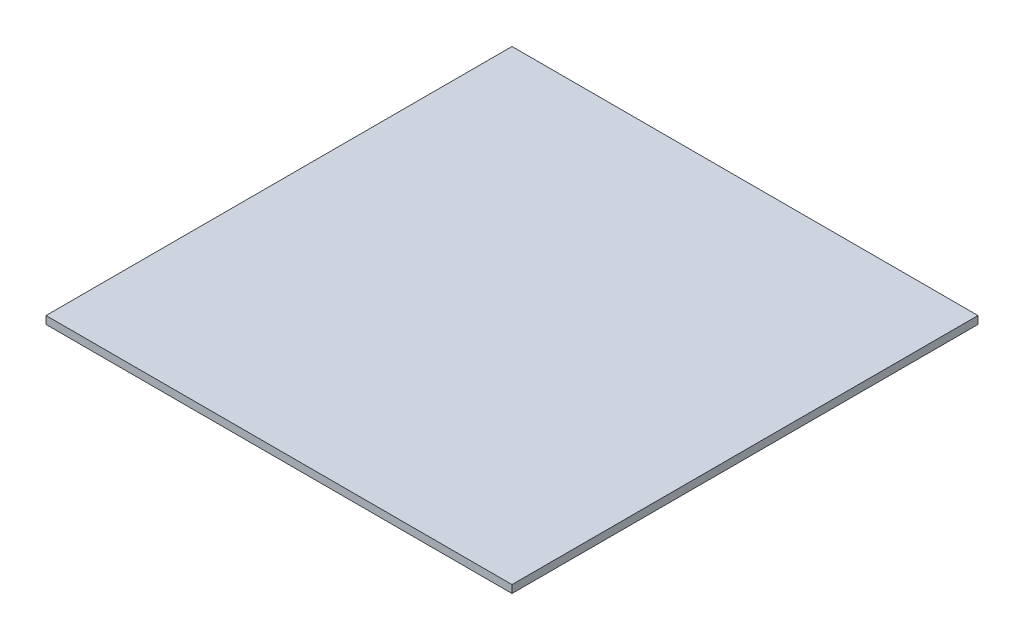
ISO-10303-21;
HEADER;
FILE_DESCRIPTION(('STEP AP214'),'2;1');
FILE_NAME('part.step','',(''),(''),'','','');
FILE_SCHEMA(('AUTOMOTIVE_DESIGN { 1 0 10303 214 1 1 1 1 }'));
ENDSEC;
DATA;
#1=APPLICATION_CONTEXT('core data for automotive mechanical design processes');
#2=APPLICATION_PROTOCOL_DEFINITION('international standard','automotive_design',2000,#1);
#3=PRODUCT_CONTEXT('',#1,'mechanical');
#4=PRODUCT('Part','Part','',(#3));
#5=PRODUCT_RELATED_PRODUCT_CATEGORY('part','',(#4));
#6=PRODUCT_DEFINITION_FORMATION('','',#4);
#7=PRODUCT_DEFINITION_CONTEXT('part definition',#1,'design');
#8=PRODUCT_DEFINITION('design','',#6,#7);
#9=PRODUCT_DEFINITION_SHAPE('','',#8);
#10=(LENGTH_UNIT() NAMED_UNIT(*) SI_UNIT(.MILLI.,.METRE.));
#11=(NAMED_UNIT(*) PLANE_ANGLE_UNIT() SI_UNIT($,.RADIAN.));
#12=(NAMED_UNIT(*) SI_UNIT($,.STERADIAN.) SOLID_ANGLE_UNIT());
#13=UNCERTAINTY_MEASURE_WITH_UNIT(LENGTH_MEASURE(1.E-05),#10,'distance_accuracy_value','');
#14=(GEOMETRIC_REPRESENTATION_CONTEXT(3) GLOBAL_UNCERTAINTY_ASSIGNED_CONTEXT((#13)) GLOBAL_UNIT_ASSIGNED_CONTEXT((#10,
#11,#12)) REPRESENTATION_CONTEXT('',''));
#15=CARTESIAN_POINT('',(0.,0.,0.));
#16=DIRECTION('',(0.,0.,1.));
#17=DIRECTION('',(1.,0.,0.));
#18=AXIS2_PLACEMENT_3D('',#15,#16,#17);
#19=CARTESIAN_POINT('',(-164.78286019571,5.,-100.878594249201));
#20=DIRECTION('',(0.,0.,-1.));
#21=DIRECTION('',(-1.,0.,0.));
#22=AXIS2_PLACEMENT_3D('',#19,#20,#21);
#23=PLANE('',#22);
#24=DIRECTION('',(1.,0.,0.));
#25=VECTOR('',#24,1.);
#26=CARTESIAN_POINT('',(-164.78286019571,0.,-100.878594249201));
#27=LINE('',#26,#25);
#28=CARTESIAN_POINT('',(-164.78286019571,0.,-100.878594249201));
#29=VERTEX_POINT('',#28);
#30=CARTESIAN_POINT('',(135.21713980429,0.,-100.878594249201));
#31=VERTEX_POINT('',#30);
#32=EDGE_CURVE('E110',#29,#31,#27,.T.);
#33=ORIENTED_EDGE('',*,*,#32,.F.);
#34=DIRECTION('',(0.,-1.,0.));
#35=VECTOR('',#34,1.);
#36=CARTESIAN_POINT('',(-164.78286019571,5.,-100.878594249201));
#37=LINE('',#36,#35);
#38=CARTESIAN_POINT('',(-164.78286019571,5.,-100.878594249201));
#39=VERTEX_POINT('',#38);
#40=EDGE_CURVE('E11',#39,#29,#37,.T.);
#41=ORIENTED_EDGE('',*,*,#40,.F.);
#42=DIRECTION('',(1.,0.,0.));
#43=VECTOR('',#42,1.);
#44=CARTESIAN_POINT('',(-164.78286019571,5.,-100.878594249201));
#45=LINE('',#44,#43);
#46=CARTESIAN_POINT('',(135.21713980429,5.,-100.878594249201));
#47=VERTEX_POINT('',#46);
#48=EDGE_CURVE('E103',#39,#47,#45,.T.);
#49=ORIENTED_EDGE('',*,*,#48,.T.);
#50=DIRECTION('',(0.,-1.,0.));
#51=VECTOR('',#50,1.);
#52=CARTESIAN_POINT('',(135.21713980429,5.,-100.878594249201));
#53=LINE('',#52,#51);
#54=EDGE_CURVE('E42',#47,#31,#53,.T.);
#55=ORIENTED_EDGE('',*,*,#54,.T.);
#56=EDGE_LOOP('',(#33,#41,#49,#55));
#57=FACE_BOUND('',#56,.T.);
#58=ADVANCED_FACE('F39',(#57),#23,.T.);
#59=CARTESIAN_POINT('',(-164.78286019571,5.,-100.878594249201));
#60=DIRECTION('',(1.,0.,0.));
#61=DIRECTION('',(0.,0.,-1.));
#62=AXIS2_PLACEMENT_3D('',#59,#60,#61);
#63=PLANE('',#62);
#64=DIRECTION('',(0.,0.,1.));
#65=VECTOR('',#64,1.);
#66=CARTESIAN_POINT('',(-164.78286019571,0.,-100.878594249201));
#67=LINE('',#66,#65);
#68=CARTESIAN_POINT('',(-164.78286019571,0.,199.121405750799));
#69=VERTEX_POINT('',#68);
#70=EDGE_CURVE('E73',#29,#69,#67,.T.);
#71=ORIENTED_EDGE('',*,*,#70,.T.);
#72=DIRECTION('',(0.,-1.,0.));
#73=VECTOR('',#72,1.);
#74=CARTESIAN_POINT('',(-164.78286019571,5.,199.121405750799));
#75=LINE('',#74,#73);
#76=CARTESIAN_POINT('',(-164.78286019571,5.,199.121405750799));
#77=VERTEX_POINT('',#76);
#78=EDGE_CURVE('E49',#77,#69,#75,.T.);
#79=ORIENTED_EDGE('',*,*,#78,.F.);
#80=DIRECTION('',(0.,0.,1.));
#81=VECTOR('',#80,1.);
#82=CARTESIAN_POINT('',(-164.78286019571,5.,-100.878594249201));
#83=LINE('',#82,#81);
#84=EDGE_CURVE('E90',#39,#77,#83,.T.);
#85=ORIENTED_EDGE('',*,*,#84,.F.);
#86=ORIENTED_EDGE('',*,*,#40,.T.);
#87=EDGE_LOOP('',(#71,#79,#85,#86));
#88=FACE_BOUND('',#87,.T.);
#89=ADVANCED_FACE('F126',(#88),#63,.F.);
#90=CARTESIAN_POINT('',(-164.78286019571,5.,199.121405750799));
#91=DIRECTION('',(0.,0.,-1.));
#92=DIRECTION('',(-1.,0.,0.));
#93=AXIS2_PLACEMENT_3D('',#90,#91,#92);
#94=PLANE('',#93);
#95=DIRECTION('',(1.,0.,0.));
#96=VECTOR('',#95,1.);
#97=CARTESIAN_POINT('',(-164.78286019571,0.,199.121405750799));
#98=LINE('',#97,#96);
#99=CARTESIAN_POINT('',(135.21713980429,0.,199.121405750799));
#100=VERTEX_POINT('',#99);
#101=EDGE_CURVE('E98',#69,#100,#98,.T.);
#102=ORIENTED_EDGE('',*,*,#101,.T.);
#103=DIRECTION('',(0.,-1.,0.));
#104=VECTOR('',#103,1.);
#105=CARTESIAN_POINT('',(135.21713980429,5.,199.121405750799));
#106=LINE('',#105,#104);
#107=CARTESIAN_POINT('',(135.21713980429,5.,199.121405750799));
#108=VERTEX_POINT('',#107);
#109=EDGE_CURVE('E95',#108,#100,#106,.T.);
#110=ORIENTED_EDGE('',*,*,#109,.F.);
#111=DIRECTION('',(1.,0.,0.));
#112=VECTOR('',#111,1.);
#113=CARTESIAN_POINT('',(-164.78286019571,5.,199.121405750799));
#114=LINE('',#113,#112);
#115=EDGE_CURVE('E85',#77,#108,#114,.T.);
#116=ORIENTED_EDGE('',*,*,#115,.F.);
#117=ORIENTED_EDGE('',*,*,#78,.T.);
#118=EDGE_LOOP('',(#102,#110,#116,#117));
#119=FACE_BOUND('',#118,.T.);
#120=ADVANCED_FACE('F96',(#119),#94,.F.);
#121=CARTESIAN_POINT('',(135.21713980429,5.,-100.878594249201));
#122=DIRECTION('',(1.,0.,0.));
#123=DIRECTION('',(0.,0.,-1.));
#124=AXIS2_PLACEMENT_3D('',#121,#122,#123);
#125=PLANE('',#124);
#126=DIRECTION('',(0.,0.,1.));
#127=VECTOR('',#126,1.);
#128=CARTESIAN_POINT('',(135.21713980429,0.,-100.878594249201));
#129=LINE('',#128,#127);
#130=EDGE_CURVE('E114',#31,#100,#129,.T.);
#131=ORIENTED_EDGE('',*,*,#130,.F.);
#132=ORIENTED_EDGE('',*,*,#54,.F.);
#133=DIRECTION('',(0.,0.,1.));
#134=VECTOR('',#133,1.);
#135=CARTESIAN_POINT('',(135.21713980429,5.,-100.878594249201));
#136=LINE('',#135,#134);
#137=EDGE_CURVE('E89',#47,#108,#136,.T.);
#138=ORIENTED_EDGE('',*,*,#137,.T.);
#139=ORIENTED_EDGE('',*,*,#109,.T.);
#140=EDGE_LOOP('',(#131,#132,#138,#139));
#141=FACE_BOUND('',#140,.T.);
#142=ADVANCED_FACE('F101',(#141),#125,.T.);
#143=CARTESIAN_POINT('',(0.,5.,0.));
#144=DIRECTION('',(0.,-1.,0.));
#145=DIRECTION('',(0.,0.,-1.));
#146=AXIS2_PLACEMENT_3D('',#143,#144,#145);
#147=PLANE('',#146);
#148=ORIENTED_EDGE('',*,*,#48,.F.);
#149=ORIENTED_EDGE('',*,*,#84,.T.);
#150=ORIENTED_EDGE('',*,*,#115,.T.);
#151=ORIENTED_EDGE('',*,*,#137,.F.);
#152=EDGE_LOOP('',(#148,#149,#150,#151));
#153=FACE_BOUND('',#152,.T.);
#154=ADVANCED_FACE('F88',(#153),#147,.F.);
#155=CARTESIAN_POINT('',(0.,0.,0.));
#156=DIRECTION('',(0.,-1.,0.));
#157=DIRECTION('',(0.,0.,-1.));
#158=AXIS2_PLACEMENT_3D('',#155,#156,#157);
#159=PLANE('',#158);
#160=ORIENTED_EDGE('',*,*,#32,.T.);
#161=ORIENTED_EDGE('',*,*,#130,.T.);
#162=ORIENTED_EDGE('',*,*,#101,.F.);
#163=ORIENTED_EDGE('',*,*,#70,.F.);
#164=EDGE_LOOP('',(#160,#161,#162,#163));
#165=FACE_BOUND('',#164,.T.);
#166=ADVANCED_FACE('F123',(#165),#159,.T.);
#167=CLOSED_SHELL('',(#58,#89,#120,#142,#154,#166));
#168=MANIFOLD_SOLID_BREP('B2',#167);
#169=ADVANCED_BREP_SHAPE_REPRESENTATION('',(#18,#168),#14);
#170=SHAPE_DEFINITION_REPRESENTATION(#9,#169);
ENDSEC;
END-ISO-10303-21;
